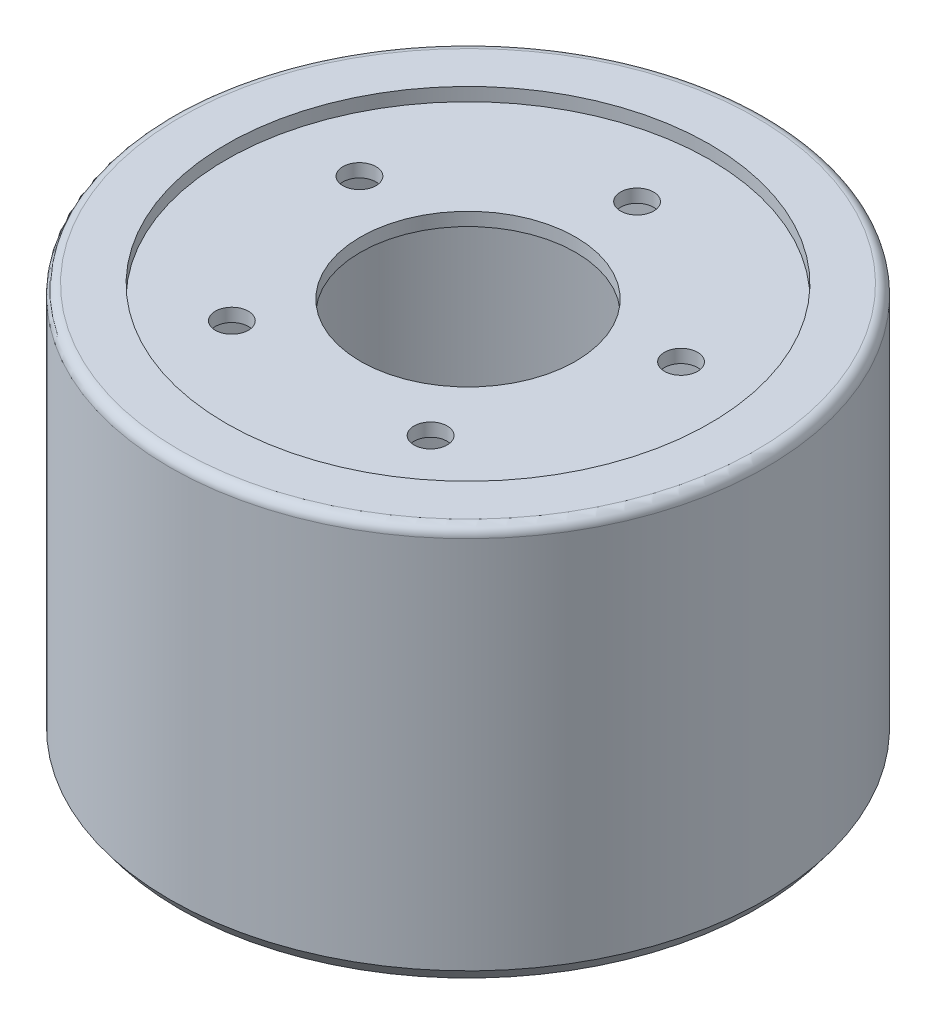
ISO-10303-21;
HEADER;
FILE_DESCRIPTION(('STEP AP214'),'2;1');
FILE_NAME('part.step','',(''),(''),'','','');
FILE_SCHEMA(('AUTOMOTIVE_DESIGN { 1 0 10303 214 1 1 1 1 }'));
ENDSEC;
DATA;
#1=APPLICATION_CONTEXT('core data for automotive mechanical design processes');
#2=APPLICATION_PROTOCOL_DEFINITION('international standard','automotive_design',2000,#1);
#3=PRODUCT_CONTEXT('',#1,'mechanical');
#4=PRODUCT('Part','Part','',(#3));
#5=PRODUCT_RELATED_PRODUCT_CATEGORY('part','',(#4));
#6=PRODUCT_DEFINITION_FORMATION('','',#4);
#7=PRODUCT_DEFINITION_CONTEXT('part definition',#1,'design');
#8=PRODUCT_DEFINITION('design','',#6,#7);
#9=PRODUCT_DEFINITION_SHAPE('','',#8);
#10=(LENGTH_UNIT() NAMED_UNIT(*) SI_UNIT(.MILLI.,.METRE.));
#11=(NAMED_UNIT(*) PLANE_ANGLE_UNIT() SI_UNIT($,.RADIAN.));
#12=(NAMED_UNIT(*) SI_UNIT($,.STERADIAN.) SOLID_ANGLE_UNIT());
#13=UNCERTAINTY_MEASURE_WITH_UNIT(LENGTH_MEASURE(1.E-05),#10,'distance_accuracy_value','');
#14=(GEOMETRIC_REPRESENTATION_CONTEXT(3) GLOBAL_UNCERTAINTY_ASSIGNED_CONTEXT((#13)) GLOBAL_UNIT_ASSIGNED_CONTEXT((#10,
#11,#12)) REPRESENTATION_CONTEXT('',''));
#15=CARTESIAN_POINT('',(0.,0.,0.));
#16=DIRECTION('',(0.,0.,1.));
#17=DIRECTION('',(1.,0.,0.));
#18=AXIS2_PLACEMENT_3D('',#15,#16,#17);
#19=CARTESIAN_POINT('',(0.,60.,0.));
#20=DIRECTION('',(0.,-1.,0.));
#21=DIRECTION('',(0.,0.,-1.));
#22=AXIS2_PLACEMENT_3D('',#19,#20,#21);
#23=CYLINDRICAL_SURFACE('',#22,36.5);
#24=CARTESIAN_POINT('',(0.,0.,0.));
#25=DIRECTION('',(0.,1.,0.));
#26=DIRECTION('',(0.,0.,1.));
#27=AXIS2_PLACEMENT_3D('',#24,#25,#26);
#28=CIRCLE('',#27,36.5);
#29=CARTESIAN_POINT('',(0.,0.,36.5));
#30=VERTEX_POINT('',#29);
#31=EDGE_CURVE('E77',#30,#30,#28,.T.);
#32=ORIENTED_EDGE('',*,*,#31,.F.);
#33=EDGE_LOOP('',(#32));
#34=FACE_BOUND('',#33,.T.);
#35=CARTESIAN_POINT('',(0.,56.,0.));
#36=DIRECTION('',(0.,1.,0.));
#37=DIRECTION('',(0.,0.,1.));
#38=AXIS2_PLACEMENT_3D('',#35,#36,#37);
#39=CIRCLE('',#38,36.5);
#40=CARTESIAN_POINT('',(0.,56.,36.5));
#41=VERTEX_POINT('',#40);
#42=EDGE_CURVE('E85',#41,#41,#39,.T.);
#43=ORIENTED_EDGE('',*,*,#42,.T.);
#44=EDGE_LOOP('',(#43));
#45=FACE_BOUND('',#44,.T.);
#46=ADVANCED_FACE('F47',(#34,#45),#23,.F.);
#47=CARTESIAN_POINT('',(0.,58.,0.));
#48=DIRECTION('',(0.,1.,0.));
#49=DIRECTION('',(0.,0.,1.));
#50=AXIS2_PLACEMENT_3D('',#47,#48,#49);
#51=CIRCLE('',#50,36.5);
#52=CARTESIAN_POINT('',(0.,58.,36.5));
#53=VERTEX_POINT('',#52);
#54=EDGE_CURVE('E61',#53,#53,#51,.T.);
#55=ORIENTED_EDGE('',*,*,#54,.F.);
#56=EDGE_LOOP('',(#55));
#57=FACE_BOUND('',#56,.T.);
#58=CARTESIAN_POINT('',(0.,60.,0.));
#59=DIRECTION('',(0.,1.,0.));
#60=DIRECTION('',(0.,0.,1.));
#61=AXIS2_PLACEMENT_3D('',#58,#59,#60);
#62=CIRCLE('',#61,36.5);
#63=CARTESIAN_POINT('',(0.,60.,36.5));
#64=VERTEX_POINT('',#63);
#65=EDGE_CURVE('E76',#64,#64,#62,.T.);
#66=ORIENTED_EDGE('',*,*,#65,.T.);
#67=EDGE_LOOP('',(#66));
#68=FACE_BOUND('',#67,.T.);
#69=ADVANCED_FACE('F157',(#57,#68),#23,.F.);
#70=CARTESIAN_POINT('',(0.,60.,0.));
#71=DIRECTION('',(0.,-1.,0.));
#72=DIRECTION('',(0.,0.,-1.));
#73=AXIS2_PLACEMENT_3D('',#70,#71,#72);
#74=CYLINDRICAL_SURFACE('',#73,44.9999999999999);
#75=CARTESIAN_POINT('',(0.,1.99999999999997,0.));
#76=DIRECTION('',(0.,1.,0.));
#77=DIRECTION('',(0.,0.,1.));
#78=AXIS2_PLACEMENT_3D('',#75,#76,#77);
#79=CIRCLE('',#78,44.9999999999999);
#80=CARTESIAN_POINT('',(0.,1.99999999999997,44.9999999999999));
#81=VERTEX_POINT('',#80);
#82=EDGE_CURVE('E56',#81,#81,#79,.T.);
#83=ORIENTED_EDGE('',*,*,#82,.T.);
#84=EDGE_LOOP('',(#83));
#85=FACE_BOUND('',#84,.T.);
#86=CARTESIAN_POINT('',(0.,58.5,0.));
#87=DIRECTION('',(0.,1.,0.));
#88=DIRECTION('',(0.,0.,1.));
#89=AXIS2_PLACEMENT_3D('',#86,#87,#88);
#90=CIRCLE('',#89,44.9999999999999);
#91=CARTESIAN_POINT('',(0.,58.5,44.9999999999999));
#92=VERTEX_POINT('',#91);
#93=EDGE_CURVE('E66',#92,#92,#90,.F.);
#94=ORIENTED_EDGE('',*,*,#93,.T.);
#95=EDGE_LOOP('',(#94));
#96=FACE_BOUND('',#95,.T.);
#97=ADVANCED_FACE('F160',(#85,#96),#74,.T.);
#98=CARTESIAN_POINT('',(0.,60.,0.));
#99=DIRECTION('',(0.,1.,0.));
#100=DIRECTION('',(0.,0.,1.));
#101=AXIS2_PLACEMENT_3D('',#98,#99,#100);
#102=PLANE('',#101);
#103=CARTESIAN_POINT('',(0.,60.,0.));
#104=DIRECTION('',(0.,1.,0.));
#105=DIRECTION('',(0.,0.,1.));
#106=AXIS2_PLACEMENT_3D('',#103,#104,#105);
#107=CIRCLE('',#106,43.4999999999999);
#108=CARTESIAN_POINT('',(0.,60.,43.4999999999999));
#109=VERTEX_POINT('',#108);
#110=EDGE_CURVE('E72',#109,#109,#107,.T.);
#111=ORIENTED_EDGE('',*,*,#110,.T.);
#112=EDGE_LOOP('',(#111));
#113=FACE_BOUND('',#112,.T.);
#114=ORIENTED_EDGE('',*,*,#65,.F.);
#115=EDGE_LOOP('',(#114));
#116=FACE_BOUND('',#115,.T.);
#117=ADVANCED_FACE('F164',(#113,#116),#102,.T.);
#118=CARTESIAN_POINT('',(0.,0.,0.));
#119=DIRECTION('',(0.,1.,0.));
#120=DIRECTION('',(0.,0.,1.));
#121=AXIS2_PLACEMENT_3D('',#118,#119,#120);
#122=PLANE('',#121);
#123=CARTESIAN_POINT('',(0.,0.,0.));
#124=DIRECTION('',(0.,1.,0.));
#125=DIRECTION('',(0.,0.,1.));
#126=AXIS2_PLACEMENT_3D('',#123,#124,#125);
#127=CIRCLE('',#126,43.5);
#128=CARTESIAN_POINT('',(0.,0.,43.5));
#129=VERTEX_POINT('',#128);
#130=EDGE_CURVE('E10',#129,#129,#127,.F.);
#131=ORIENTED_EDGE('',*,*,#130,.T.);
#132=EDGE_LOOP('',(#131));
#133=FACE_BOUND('',#132,.T.);
#134=ORIENTED_EDGE('',*,*,#31,.T.);
#135=EDGE_LOOP('',(#134));
#136=FACE_BOUND('',#135,.T.);
#137=ADVANCED_FACE('F166',(#133,#136),#122,.F.);
#138=CARTESIAN_POINT('',(0.,58.5,0.));
#139=DIRECTION('',(0.,1.,0.));
#140=DIRECTION('',(0.,0.,1.));
#141=AXIS2_PLACEMENT_3D('',#138,#139,#140);
#142=TOROIDAL_SURFACE('',#141,43.4999999999999,1.5);
#143=ORIENTED_EDGE('',*,*,#93,.F.);
#144=EDGE_LOOP('',(#143));
#145=FACE_BOUND('',#144,.T.);
#146=ORIENTED_EDGE('',*,*,#110,.F.);
#147=EDGE_LOOP('',(#146));
#148=FACE_BOUND('',#147,.T.);
#149=ADVANCED_FACE('F173',(#145,#148),#142,.T.);
#150=CARTESIAN_POINT('',(0.,58.,0.));
#151=DIRECTION('',(0.,-1.,0.));
#152=DIRECTION('',(0.,0.,-1.));
#153=AXIS2_PLACEMENT_3D('',#150,#151,#152);
#154=CYLINDRICAL_SURFACE('',#153,16.25);
#155=CARTESIAN_POINT('',(0.,58.,0.));
#156=DIRECTION('',(0.,1.,0.));
#157=DIRECTION('',(0.,0.,1.));
#158=AXIS2_PLACEMENT_3D('',#155,#156,#157);
#159=CIRCLE('',#158,16.25);
#160=CARTESIAN_POINT('',(0.,58.,16.25));
#161=VERTEX_POINT('',#160);
#162=EDGE_CURVE('E81',#161,#161,#159,.T.);
#163=ORIENTED_EDGE('',*,*,#162,.T.);
#164=EDGE_LOOP('',(#163));
#165=FACE_BOUND('',#164,.T.);
#166=CARTESIAN_POINT('',(0.,56.,0.));
#167=DIRECTION('',(0.,1.,0.));
#168=DIRECTION('',(0.,0.,1.));
#169=AXIS2_PLACEMENT_3D('',#166,#167,#168);
#170=CIRCLE('',#169,16.25);
#171=CARTESIAN_POINT('',(0.,56.,16.25));
#172=VERTEX_POINT('',#171);
#173=EDGE_CURVE('E90',#172,#172,#170,.T.);
#174=ORIENTED_EDGE('',*,*,#173,.F.);
#175=EDGE_LOOP('',(#174));
#176=FACE_BOUND('',#175,.T.);
#177=ADVANCED_FACE('F184',(#165,#176),#154,.F.);
#178=CARTESIAN_POINT('',(0.,58.,-25.52));
#179=DIRECTION('',(0.,-1.,0.));
#180=DIRECTION('',(0.,0.,-1.));
#181=AXIS2_PLACEMENT_3D('',#178,#179,#180);
#182=CYLINDRICAL_SURFACE('',#181,2.5);
#183=CARTESIAN_POINT('',(0.,58.,-25.52));
#184=DIRECTION('',(0.,1.,0.));
#185=DIRECTION('',(0.,0.,1.));
#186=AXIS2_PLACEMENT_3D('',#183,#184,#185);
#187=CIRCLE('',#186,2.5);
#188=CARTESIAN_POINT('',(0.,58.,-23.02));
#189=VERTEX_POINT('',#188);
#190=EDGE_CURVE('E117',#189,#189,#187,.T.);
#191=ORIENTED_EDGE('',*,*,#190,.T.);
#192=EDGE_LOOP('',(#191));
#193=FACE_BOUND('',#192,.T.);
#194=CARTESIAN_POINT('',(0.,56.,-25.52));
#195=DIRECTION('',(0.,1.,0.));
#196=DIRECTION('',(0.,0.,1.));
#197=AXIS2_PLACEMENT_3D('',#194,#195,#196);
#198=CIRCLE('',#197,2.5);
#199=CARTESIAN_POINT('',(0.,56.,-23.02));
#200=VERTEX_POINT('',#199);
#201=EDGE_CURVE('E94',#200,#200,#198,.T.);
#202=ORIENTED_EDGE('',*,*,#201,.F.);
#203=EDGE_LOOP('',(#202));
#204=FACE_BOUND('',#203,.T.);
#205=ADVANCED_FACE('F189',(#193,#204),#182,.F.);
#206=CARTESIAN_POINT('',(24.2709622958523,58.,-7.88611369644866));
#207=DIRECTION('',(0.,-1.,0.));
#208=DIRECTION('',(0.,0.,-1.));
#209=AXIS2_PLACEMENT_3D('',#206,#207,#208);
#210=CYLINDRICAL_SURFACE('',#209,2.5);
#211=CARTESIAN_POINT('',(24.2709622958523,58.,-7.88611369644866));
#212=DIRECTION('',(0.,1.,0.));
#213=DIRECTION('',(0.,0.,1.));
#214=AXIS2_PLACEMENT_3D('',#211,#212,#213);
#215=CIRCLE('',#214,2.5);
#216=CARTESIAN_POINT('',(24.2709622958523,58.,-5.38611369644866));
#217=VERTEX_POINT('',#216);
#218=EDGE_CURVE('E121',#217,#217,#215,.T.);
#219=ORIENTED_EDGE('',*,*,#218,.T.);
#220=EDGE_LOOP('',(#219));
#221=FACE_BOUND('',#220,.T.);
#222=CARTESIAN_POINT('',(24.2709622958523,56.,-7.88611369644866));
#223=DIRECTION('',(0.,1.,0.));
#224=DIRECTION('',(0.,0.,1.));
#225=AXIS2_PLACEMENT_3D('',#222,#223,#224);
#226=CIRCLE('',#225,2.5);
#227=CARTESIAN_POINT('',(24.2709622958523,56.,-5.38611369644866));
#228=VERTEX_POINT('',#227);
#229=EDGE_CURVE('E98',#228,#228,#226,.T.);
#230=ORIENTED_EDGE('',*,*,#229,.F.);
#231=EDGE_LOOP('',(#230));
#232=FACE_BOUND('',#231,.T.);
#233=ADVANCED_FACE('F199',(#221,#232),#210,.F.);
#234=CARTESIAN_POINT('',(15.0002796385039,58.,20.6461136964487));
#235=DIRECTION('',(0.,-1.,0.));
#236=DIRECTION('',(0.,0.,-1.));
#237=AXIS2_PLACEMENT_3D('',#234,#235,#236);
#238=CYLINDRICAL_SURFACE('',#237,2.5);
#239=CARTESIAN_POINT('',(15.0002796385039,58.,20.6461136964487));
#240=DIRECTION('',(0.,1.,0.));
#241=DIRECTION('',(0.,0.,1.));
#242=AXIS2_PLACEMENT_3D('',#239,#240,#241);
#243=CIRCLE('',#242,2.5);
#244=CARTESIAN_POINT('',(15.0002796385039,58.,23.1461136964487));
#245=VERTEX_POINT('',#244);
#246=EDGE_CURVE('E125',#245,#245,#243,.T.);
#247=ORIENTED_EDGE('',*,*,#246,.T.);
#248=EDGE_LOOP('',(#247));
#249=FACE_BOUND('',#248,.T.);
#250=CARTESIAN_POINT('',(15.0002796385039,56.,20.6461136964487));
#251=DIRECTION('',(0.,1.,0.));
#252=DIRECTION('',(0.,0.,1.));
#253=AXIS2_PLACEMENT_3D('',#250,#251,#252);
#254=CIRCLE('',#253,2.5);
#255=CARTESIAN_POINT('',(15.0002796385039,56.,23.1461136964487));
#256=VERTEX_POINT('',#255);
#257=EDGE_CURVE('E102',#256,#256,#254,.T.);
#258=ORIENTED_EDGE('',*,*,#257,.F.);
#259=EDGE_LOOP('',(#258));
#260=FACE_BOUND('',#259,.T.);
#261=ADVANCED_FACE('F207',(#249,#260),#238,.F.);
#262=CARTESIAN_POINT('',(-15.0002796385039,58.,20.6461136964487));
#263=DIRECTION('',(0.,-1.,0.));
#264=DIRECTION('',(0.,0.,-1.));
#265=AXIS2_PLACEMENT_3D('',#262,#263,#264);
#266=CYLINDRICAL_SURFACE('',#265,2.5);
#267=CARTESIAN_POINT('',(-15.0002796385039,58.,20.6461136964487));
#268=DIRECTION('',(0.,1.,0.));
#269=DIRECTION('',(0.,0.,1.));
#270=AXIS2_PLACEMENT_3D('',#267,#268,#269);
#271=CIRCLE('',#270,2.5);
#272=CARTESIAN_POINT('',(-15.0002796385039,58.,23.1461136964487));
#273=VERTEX_POINT('',#272);
#274=EDGE_CURVE('E129',#273,#273,#271,.T.);
#275=ORIENTED_EDGE('',*,*,#274,.T.);
#276=EDGE_LOOP('',(#275));
#277=FACE_BOUND('',#276,.T.);
#278=CARTESIAN_POINT('',(-15.0002796385039,56.,20.6461136964487));
#279=DIRECTION('',(0.,1.,0.));
#280=DIRECTION('',(0.,0.,1.));
#281=AXIS2_PLACEMENT_3D('',#278,#279,#280);
#282=CIRCLE('',#281,2.5);
#283=CARTESIAN_POINT('',(-15.0002796385039,56.,23.1461136964487));
#284=VERTEX_POINT('',#283);
#285=EDGE_CURVE('E106',#284,#284,#282,.T.);
#286=ORIENTED_EDGE('',*,*,#285,.F.);
#287=EDGE_LOOP('',(#286));
#288=FACE_BOUND('',#287,.T.);
#289=ADVANCED_FACE('F211',(#277,#288),#266,.F.);
#290=CARTESIAN_POINT('',(-24.2709622958523,58.,-7.88611369644865));
#291=DIRECTION('',(0.,-1.,0.));
#292=DIRECTION('',(0.,0.,-1.));
#293=AXIS2_PLACEMENT_3D('',#290,#291,#292);
#294=CYLINDRICAL_SURFACE('',#293,2.5);
#295=CARTESIAN_POINT('',(-24.2709622958523,58.,-7.88611369644865));
#296=DIRECTION('',(0.,1.,0.));
#297=DIRECTION('',(0.,0.,1.));
#298=AXIS2_PLACEMENT_3D('',#295,#296,#297);
#299=CIRCLE('',#298,2.5);
#300=CARTESIAN_POINT('',(-24.2709622958523,58.,-5.38611369644866));
#301=VERTEX_POINT('',#300);
#302=EDGE_CURVE('E89',#301,#301,#299,.T.);
#303=ORIENTED_EDGE('',*,*,#302,.T.);
#304=EDGE_LOOP('',(#303));
#305=FACE_BOUND('',#304,.T.);
#306=CARTESIAN_POINT('',(-24.2709622958523,56.,-7.88611369644865));
#307=DIRECTION('',(0.,1.,0.));
#308=DIRECTION('',(0.,0.,1.));
#309=AXIS2_PLACEMENT_3D('',#306,#307,#308);
#310=CIRCLE('',#309,2.5);
#311=CARTESIAN_POINT('',(-24.2709622958523,56.,-5.38611369644866));
#312=VERTEX_POINT('',#311);
#313=EDGE_CURVE('E110',#312,#312,#310,.T.);
#314=ORIENTED_EDGE('',*,*,#313,.F.);
#315=EDGE_LOOP('',(#314));
#316=FACE_BOUND('',#315,.T.);
#317=ADVANCED_FACE('F137',(#305,#316),#294,.F.);
#318=CARTESIAN_POINT('',(0.,58.,0.));
#319=DIRECTION('',(0.,1.,0.));
#320=DIRECTION('',(0.,0.,1.));
#321=AXIS2_PLACEMENT_3D('',#318,#319,#320);
#322=PLANE('',#321);
#323=ORIENTED_EDGE('',*,*,#302,.F.);
#324=EDGE_LOOP('',(#323));
#325=FACE_BOUND('',#324,.T.);
#326=ORIENTED_EDGE('',*,*,#274,.F.);
#327=EDGE_LOOP('',(#326));
#328=FACE_BOUND('',#327,.T.);
#329=ORIENTED_EDGE('',*,*,#246,.F.);
#330=EDGE_LOOP('',(#329));
#331=FACE_BOUND('',#330,.T.);
#332=ORIENTED_EDGE('',*,*,#218,.F.);
#333=EDGE_LOOP('',(#332));
#334=FACE_BOUND('',#333,.T.);
#335=ORIENTED_EDGE('',*,*,#190,.F.);
#336=EDGE_LOOP('',(#335));
#337=FACE_BOUND('',#336,.T.);
#338=ORIENTED_EDGE('',*,*,#162,.F.);
#339=EDGE_LOOP('',(#338));
#340=FACE_BOUND('',#339,.T.);
#341=ORIENTED_EDGE('',*,*,#54,.T.);
#342=EDGE_LOOP('',(#341));
#343=FACE_BOUND('',#342,.T.);
#344=ADVANCED_FACE('F140',(#325,#328,#331,#334,#337,#340,#343),#322,.T.);
#345=CARTESIAN_POINT('',(0.,56.,0.));
#346=DIRECTION('',(0.,1.,0.));
#347=DIRECTION('',(0.,0.,1.));
#348=AXIS2_PLACEMENT_3D('',#345,#346,#347);
#349=PLANE('',#348);
#350=ORIENTED_EDGE('',*,*,#313,.T.);
#351=EDGE_LOOP('',(#350));
#352=FACE_BOUND('',#351,.T.);
#353=ORIENTED_EDGE('',*,*,#285,.T.);
#354=EDGE_LOOP('',(#353));
#355=FACE_BOUND('',#354,.T.);
#356=ORIENTED_EDGE('',*,*,#257,.T.);
#357=EDGE_LOOP('',(#356));
#358=FACE_BOUND('',#357,.T.);
#359=ORIENTED_EDGE('',*,*,#229,.T.);
#360=EDGE_LOOP('',(#359));
#361=FACE_BOUND('',#360,.T.);
#362=ORIENTED_EDGE('',*,*,#201,.T.);
#363=EDGE_LOOP('',(#362));
#364=FACE_BOUND('',#363,.T.);
#365=ORIENTED_EDGE('',*,*,#173,.T.);
#366=EDGE_LOOP('',(#365));
#367=FACE_BOUND('',#366,.T.);
#368=ORIENTED_EDGE('',*,*,#42,.F.);
#369=EDGE_LOOP('',(#368));
#370=FACE_BOUND('',#369,.T.);
#371=ADVANCED_FACE('F143',(#352,#355,#358,#361,#364,#367,#370),#349,.F.);
#372=CARTESIAN_POINT('',(0.,1.99999999999997,0.));
#373=DIRECTION('',(0.,1.,0.));
#374=DIRECTION('',(0.,0.,1.));
#375=AXIS2_PLACEMENT_3D('',#372,#373,#374);
#376=CONICAL_SURFACE('',#375,44.9999999999999,0.643501108793284);
#377=ORIENTED_EDGE('',*,*,#130,.F.);
#378=EDGE_LOOP('',(#377));
#379=FACE_BOUND('',#378,.T.);
#380=ORIENTED_EDGE('',*,*,#82,.F.);
#381=EDGE_LOOP('',(#380));
#382=FACE_BOUND('',#381,.T.);
#383=ADVANCED_FACE('F50',(#379,#382),#376,.T.);
#384=CLOSED_SHELL('',(#46,#69,#97,#117,#137,#149,#177,#205,#233,#261,#289,#317,#344,#371,#383));
#385=MANIFOLD_SOLID_BREP('B2',#384);
#386=ADVANCED_BREP_SHAPE_REPRESENTATION('',(#18,#385),#14);
#387=SHAPE_DEFINITION_REPRESENTATION(#9,#386);
ENDSEC;
END-ISO-10303-21;
